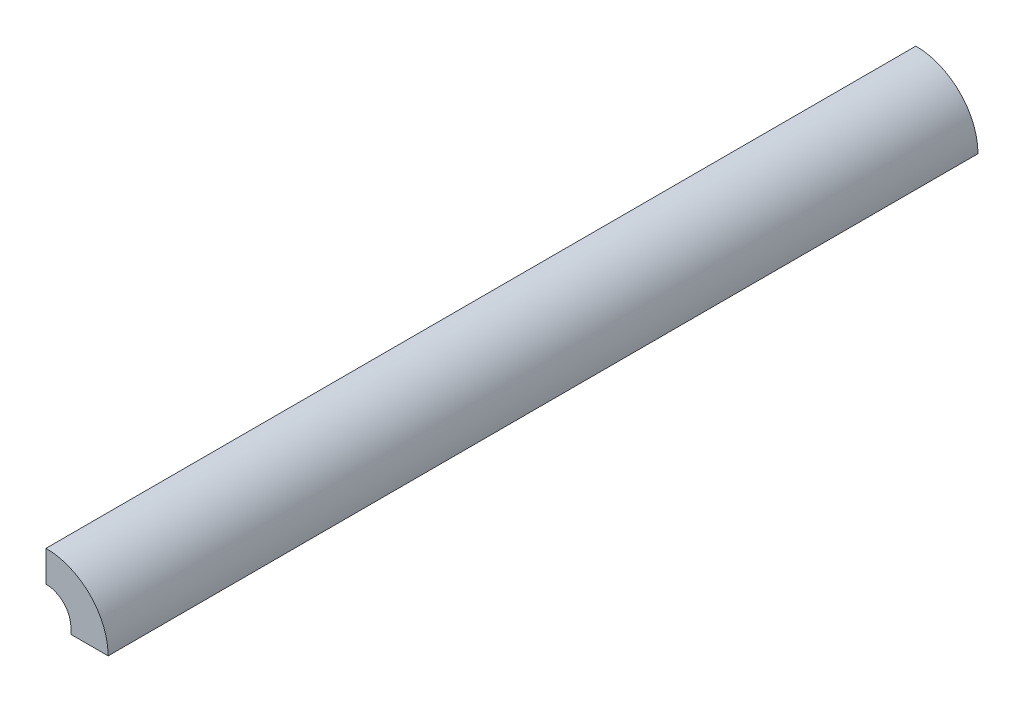
ISO-10303-21;
HEADER;
FILE_DESCRIPTION(('STEP AP214'),'2;1');
FILE_NAME('part.step','',(''),(''),'','','');
FILE_SCHEMA(('AUTOMOTIVE_DESIGN { 1 0 10303 214 1 1 1 1 }'));
ENDSEC;
DATA;
#1=APPLICATION_CONTEXT('core data for automotive mechanical design processes');
#2=APPLICATION_PROTOCOL_DEFINITION('international standard','automotive_design',2000,#1);
#3=PRODUCT_CONTEXT('',#1,'mechanical');
#4=PRODUCT('Part','Part','',(#3));
#5=PRODUCT_RELATED_PRODUCT_CATEGORY('part','',(#4));
#6=PRODUCT_DEFINITION_FORMATION('','',#4);
#7=PRODUCT_DEFINITION_CONTEXT('part definition',#1,'design');
#8=PRODUCT_DEFINITION('design','',#6,#7);
#9=PRODUCT_DEFINITION_SHAPE('','',#8);
#10=(LENGTH_UNIT() NAMED_UNIT(*) SI_UNIT(.MILLI.,.METRE.));
#11=(NAMED_UNIT(*) PLANE_ANGLE_UNIT() SI_UNIT($,.RADIAN.));
#12=(NAMED_UNIT(*) SI_UNIT($,.STERADIAN.) SOLID_ANGLE_UNIT());
#13=UNCERTAINTY_MEASURE_WITH_UNIT(LENGTH_MEASURE(1.E-05),#10,'distance_accuracy_value','');
#14=(GEOMETRIC_REPRESENTATION_CONTEXT(3) GLOBAL_UNCERTAINTY_ASSIGNED_CONTEXT((#13)) GLOBAL_UNIT_ASSIGNED_CONTEXT((#10,
#11,#12)) REPRESENTATION_CONTEXT('',''));
#15=CARTESIAN_POINT('',(0.,0.,0.));
#16=DIRECTION('',(0.,0.,1.));
#17=DIRECTION('',(1.,0.,0.));
#18=AXIS2_PLACEMENT_3D('',#15,#16,#17);
#19=CARTESIAN_POINT('',(0.,0.,350.));
#20=DIRECTION('',(0.,1.,0.));
#21=DIRECTION('',(0.,0.,1.));
#22=AXIS2_PLACEMENT_3D('',#19,#20,#21);
#23=PLANE('',#22);
#24=DIRECTION('',(0.,0.,1.));
#25=VECTOR('',#24,1.);
#26=CARTESIAN_POINT('',(10.,0.,175.));
#27=LINE('',#26,#25);
#28=CARTESIAN_POINT('',(10.,0.,194.152480481232));
#29=VERTEX_POINT('',#28);
#30=CARTESIAN_POINT('',(10.,0.,350.));
#31=VERTEX_POINT('',#30);
#32=EDGE_CURVE('E155',#29,#31,#27,.T.);
#33=ORIENTED_EDGE('',*,*,#32,.F.);
#34=CARTESIAN_POINT('',(10.,0.,194.152480481232));
#35=CARTESIAN_POINT('',(9.99998018925614,0.,193.71314903804));
#36=CARTESIAN_POINT('',(9.9964928072363,0.,193.273777713168));
#37=CARTESIAN_POINT('',(9.98069039021652,0.,192.395052165353));
#38=CARTESIAN_POINT('',(9.96837238276169,0.,191.955697997999));
#39=CARTESIAN_POINT('',(9.93290459009097,0.,191.074690346955));
#40=CARTESIAN_POINT('',(9.90968844253785,0.,190.633039401979));
#41=CARTESIAN_POINT('',(9.85032036967497,0.,189.75063378761));
#42=CARTESIAN_POINT('',(9.81416977504819,0.,189.309879030707));
#43=CARTESIAN_POINT('',(9.7260107513251,0.,188.422772337217));
#44=CARTESIAN_POINT('',(9.67375670732269,0.,187.976444343825));
#45=CARTESIAN_POINT('',(9.55109117178175,0.,187.086197515629));
#46=CARTESIAN_POINT('',(9.48067752973095,0.,186.64227897252));
#47=CARTESIAN_POINT('',(9.31919760113793,0.,185.759327821864));
#48=CARTESIAN_POINT('',(9.22818374708019,0.,185.320285728304));
#49=CARTESIAN_POINT('',(9.02253091561287,0.,184.447837761998));
#50=CARTESIAN_POINT('',(8.9078999811333,0.,184.014430023722));
#51=CARTESIAN_POINT('',(8.69096268278371,0.,183.286667692025));
#52=CARTESIAN_POINT('',(8.59557352944251,0.,182.990247202635));
#53=CARTESIAN_POINT('',(8.39074582721382,0.,182.402216480618));
#54=CARTESIAN_POINT('',(8.28130504330449,0.,182.110607021569));
#55=CARTESIAN_POINT('',(8.04743343061007,0.,181.534003278698));
#56=CARTESIAN_POINT('',(7.92302816690644,0.,181.248998677671));
#57=CARTESIAN_POINT('',(7.65792542520782,0.,180.686658613439));
#58=CARTESIAN_POINT('',(7.51722870084659,0.,180.409322796215));
#59=CARTESIAN_POINT('',(7.21688372318165,0.,179.861483769876));
#60=CARTESIAN_POINT('',(7.05706367836115,0.,179.591073836999));
#61=CARTESIAN_POINT('',(6.7185488606168,0.,179.062397225105));
#62=CARTESIAN_POINT('',(6.53985193238325,0.,178.804131937606));
#63=CARTESIAN_POINT('',(5.97411421109997,0.,178.052139061083));
#64=CARTESIAN_POINT('',(5.5568207249255,0.,177.580070850938));
#65=CARTESIAN_POINT('',(4.77000199835115,0.,176.847230078165));
#66=CARTESIAN_POINT('',(4.42091575849739,0.,176.564630350971));
#67=CARTESIAN_POINT('',(3.86721381231713,0.,176.18491538428));
#68=CARTESIAN_POINT('',(3.67762099426688,0.,176.065701470956));
#69=CARTESIAN_POINT('',(3.28900744351316,0.,175.843708084462));
#70=CARTESIAN_POINT('',(3.08998815009052,0.,175.7409261128));
#71=CARTESIAN_POINT('',(2.71034959795852,0.,175.565914392332));
#72=CARTESIAN_POINT('',(2.53076163151612,0.,175.491443391656));
#73=CARTESIAN_POINT('',(2.16615253023859,0.,175.357289714131));
#74=CARTESIAN_POINT('',(1.98113232779575,0.,175.297604515845));
#75=CARTESIAN_POINT('',(1.60704698381549,0.,175.194037216253));
#76=CARTESIAN_POINT('',(1.417989098389,0.,175.150128940234));
#77=CARTESIAN_POINT('',(1.03686871768771,0.,175.078732280556));
#78=CARTESIAN_POINT('',(0.844807901091297,0.,175.05123503755));
#79=CARTESIAN_POINT('',(0.543586606447139,0.,175.021462279594));
#80=CARTESIAN_POINT('',(0.434967821082352,0.,175.013414744946));
#81=CARTESIAN_POINT('',(0.217570676399444,0.,175.002684613787));
#82=CARTESIAN_POINT('',(0.108792571680735,0.,174.999996855403));
#83=CARTESIAN_POINT('',(0.,0.,175.));
#84=B_SPLINE_CURVE_WITH_KNOTS('',3,(#34,#35,#36,#37,#38,#39,#40,#41,#42,#43,#44,#45,#46,#47,#48,
#49,#50,#51,#52,#53,#54,#55,#56,#57,#58,#59,#60,#61,#62,#63,#64,#65,#66,#67,#68,#69,#70,#71,#72,
#73,#74,#75,#76,#77,#78,#79,#80,#81,#82,#83),.UNSPECIFIED.,.F.,.F.,(4,2,2,2,2,2,2,2,2,2,2,2,2,2,
2,2,2,2,2,2,2,2,2,2,4),(0.,1.31804093582335,2.63652574257431,3.96314550199424,5.28962881932513,
6.63743912308706,7.98540911180461,9.32998602344313,10.6741057864885,11.6079736821824,
12.5419903013156,13.474433337862,14.4068332573406,15.3483464641285,16.2899672866885,
18.1693632447245,19.5115692317236,20.1827601665664,20.8538489489553,21.4365038966371,
22.0190594150739,22.600643932571,23.1819142023473,23.5085450180642,23.8348611111894),.UNSPECIFIED.);
#85=CARTESIAN_POINT('',(0.,0.,175.));
#86=VERTEX_POINT('',#85);
#87=EDGE_CURVE('E11',#29,#86,#84,.T.);
#88=ORIENTED_EDGE('',*,*,#87,.T.);
#89=DIRECTION('',(0.,0.,-1.));
#90=VECTOR('',#89,1.);
#91=CARTESIAN_POINT('',(0.,0.,350.));
#92=LINE('',#91,#90);
#93=CARTESIAN_POINT('',(0.,0.,0.));
#94=VERTEX_POINT('',#93);
#95=EDGE_CURVE('E120',#86,#94,#92,.T.);
#96=ORIENTED_EDGE('',*,*,#95,.T.);
#97=DIRECTION('',(1.,0.,0.));
#98=VECTOR('',#97,1.);
#99=CARTESIAN_POINT('',(0.,0.,0.));
#100=LINE('',#99,#98);
#101=CARTESIAN_POINT('',(25.,0.,0.));
#102=VERTEX_POINT('',#101);
#103=EDGE_CURVE('E175',#94,#102,#100,.T.);
#104=ORIENTED_EDGE('',*,*,#103,.T.);
#105=DIRECTION('',(0.,0.,-1.));
#106=VECTOR('',#105,1.);
#107=CARTESIAN_POINT('',(25.,0.,350.));
#108=LINE('',#107,#106);
#109=CARTESIAN_POINT('',(25.,0.,350.));
#110=VERTEX_POINT('',#109);
#111=EDGE_CURVE('E163',#110,#102,#108,.T.);
#112=ORIENTED_EDGE('',*,*,#111,.F.);
#113=DIRECTION('',(1.,0.,0.));
#114=VECTOR('',#113,1.);
#115=CARTESIAN_POINT('',(0.,0.,350.));
#116=LINE('',#115,#114);
#117=EDGE_CURVE('E186',#31,#110,#116,.T.);
#118=ORIENTED_EDGE('',*,*,#117,.F.);
#119=EDGE_LOOP('',(#33,#88,#96,#104,#112,#118));
#120=FACE_BOUND('',#119,.T.);
#121=ADVANCED_FACE('F47',(#120),#23,.F.);
#122=CARTESIAN_POINT('',(0.,0.,350.));
#123=DIRECTION('',(0.,0.,-1.));
#124=DIRECTION('',(-1.,0.,0.));
#125=AXIS2_PLACEMENT_3D('',#122,#123,#124);
#126=CYLINDRICAL_SURFACE('',#125,25.);
#127=CARTESIAN_POINT('',(0.,0.,0.));
#128=DIRECTION('',(0.,0.,1.));
#129=DIRECTION('',(1.,0.,0.));
#130=AXIS2_PLACEMENT_3D('',#127,#128,#129);
#131=CIRCLE('',#130,25.);
#132=CARTESIAN_POINT('',(0.,25.,0.));
#133=VERTEX_POINT('',#132);
#134=EDGE_CURVE('E174',#102,#133,#131,.T.);
#135=ORIENTED_EDGE('',*,*,#134,.T.);
#136=DIRECTION('',(0.,0.,-1.));
#137=VECTOR('',#136,1.);
#138=CARTESIAN_POINT('',(0.,25.,350.));
#139=LINE('',#138,#137);
#140=CARTESIAN_POINT('',(0.,25.,350.));
#141=VERTEX_POINT('',#140);
#142=EDGE_CURVE('E160',#141,#133,#139,.T.);
#143=ORIENTED_EDGE('',*,*,#142,.F.);
#144=CARTESIAN_POINT('',(0.,0.,350.));
#145=DIRECTION('',(0.,0.,1.));
#146=DIRECTION('',(1.,0.,0.));
#147=AXIS2_PLACEMENT_3D('',#144,#145,#146);
#148=CIRCLE('',#147,25.);
#149=EDGE_CURVE('E117',#110,#141,#148,.T.);
#150=ORIENTED_EDGE('',*,*,#149,.F.);
#151=ORIENTED_EDGE('',*,*,#111,.T.);
#152=EDGE_LOOP('',(#135,#143,#150,#151));
#153=FACE_BOUND('',#152,.T.);
#154=ADVANCED_FACE('F137',(#153),#126,.T.);
#155=CARTESIAN_POINT('',(0.,0.,350.));
#156=DIRECTION('',(-1.,0.,0.));
#157=DIRECTION('',(0.,0.,1.));
#158=AXIS2_PLACEMENT_3D('',#155,#156,#157);
#159=PLANE('',#158);
#160=CARTESIAN_POINT('',(0.,-37.5,208.071891388307));
#161=DIRECTION('',(-1.,0.,0.));
#162=DIRECTION('',(0.,0.,1.));
#163=AXIS2_PLACEMENT_3D('',#160,#161,#162);
#164=CIRCLE('',#163,50.);
#165=CARTESIAN_POINT('',(0.,12.5,208.071891388307));
#166=VERTEX_POINT('',#165);
#167=EDGE_CURVE('E108',#166,#86,#164,.T.);
#168=ORIENTED_EDGE('',*,*,#167,.F.);
#169=DIRECTION('',(0.,0.,-1.));
#170=VECTOR('',#169,1.);
#171=CARTESIAN_POINT('',(0.,12.5,350.));
#172=LINE('',#171,#170);
#173=CARTESIAN_POINT('',(0.,12.5,350.));
#174=VERTEX_POINT('',#173);
#175=EDGE_CURVE('E101',#174,#166,#172,.T.);
#176=ORIENTED_EDGE('',*,*,#175,.F.);
#177=DIRECTION('',(0.,1.,0.));
#178=VECTOR('',#177,1.);
#179=CARTESIAN_POINT('',(0.,0.,350.));
#180=LINE('',#179,#178);
#181=EDGE_CURVE('E104',#174,#141,#180,.T.);
#182=ORIENTED_EDGE('',*,*,#181,.T.);
#183=ORIENTED_EDGE('',*,*,#142,.T.);
#184=DIRECTION('',(0.,1.,0.));
#185=VECTOR('',#184,1.);
#186=CARTESIAN_POINT('',(0.,0.,0.));
#187=LINE('',#186,#185);
#188=EDGE_CURVE('E158',#94,#133,#187,.T.);
#189=ORIENTED_EDGE('',*,*,#188,.F.);
#190=ORIENTED_EDGE('',*,*,#95,.F.);
#191=EDGE_LOOP('',(#168,#176,#182,#183,#189,#190));
#192=FACE_BOUND('',#191,.T.);
#193=ADVANCED_FACE('F103',(#192),#159,.T.);
#194=CARTESIAN_POINT('',(0.,0.,350.));
#195=DIRECTION('',(0.,0.,1.));
#196=DIRECTION('',(1.,0.,0.));
#197=AXIS2_PLACEMENT_3D('',#194,#195,#196);
#198=PLANE('',#197);
#199=ORIENTED_EDGE('',*,*,#181,.F.);
#200=CARTESIAN_POINT('',(0.,2.5,350.));
#201=DIRECTION('',(0.,0.,1.));
#202=DIRECTION('',(1.,0.,0.));
#203=AXIS2_PLACEMENT_3D('',#200,#201,#202);
#204=CIRCLE('',#203,10.);
#205=CARTESIAN_POINT('',(10.,2.5,350.));
#206=VERTEX_POINT('',#205);
#207=EDGE_CURVE('E58',#174,#206,#204,.F.);
#208=ORIENTED_EDGE('',*,*,#207,.T.);
#209=DIRECTION('',(0.,1.,0.));
#210=VECTOR('',#209,1.);
#211=CARTESIAN_POINT('',(10.,0.,350.));
#212=LINE('',#211,#210);
#213=EDGE_CURVE('E181',#31,#206,#212,.T.);
#214=ORIENTED_EDGE('',*,*,#213,.F.);
#215=ORIENTED_EDGE('',*,*,#117,.T.);
#216=ORIENTED_EDGE('',*,*,#149,.T.);
#217=EDGE_LOOP('',(#199,#208,#214,#215,#216));
#218=FACE_BOUND('',#217,.T.);
#219=ADVANCED_FACE('F113',(#218),#198,.T.);
#220=CARTESIAN_POINT('',(0.,0.,0.));
#221=DIRECTION('',(0.,0.,1.));
#222=DIRECTION('',(1.,0.,0.));
#223=AXIS2_PLACEMENT_3D('',#220,#221,#222);
#224=PLANE('',#223);
#225=ORIENTED_EDGE('',*,*,#103,.F.);
#226=ORIENTED_EDGE('',*,*,#188,.T.);
#227=ORIENTED_EDGE('',*,*,#134,.F.);
#228=EDGE_LOOP('',(#225,#226,#227));
#229=FACE_BOUND('',#228,.T.);
#230=ADVANCED_FACE('F149',(#229),#224,.F.);
#231=CARTESIAN_POINT('',(10.,-37.5,208.071891388307));
#232=DIRECTION('',(-1.,0.,0.));
#233=DIRECTION('',(0.,0.,1.));
#234=AXIS2_PLACEMENT_3D('',#231,#232,#233);
#235=PLANE('',#234);
#236=ORIENTED_EDGE('',*,*,#213,.T.);
#237=DIRECTION('',(0.,0.,-1.));
#238=VECTOR('',#237,1.);
#239=CARTESIAN_POINT('',(10.,2.49999999999997,208.071891388307));
#240=LINE('',#239,#238);
#241=CARTESIAN_POINT('',(10.,2.5,208.071891388307));
#242=VERTEX_POINT('',#241);
#243=EDGE_CURVE('E123',#206,#242,#240,.T.);
#244=ORIENTED_EDGE('',*,*,#243,.T.);
#245=CARTESIAN_POINT('',(10.,-37.5,208.071891388307));
#246=DIRECTION('',(-1.,0.,0.));
#247=DIRECTION('',(0.,0.,1.));
#248=AXIS2_PLACEMENT_3D('',#245,#246,#247);
#249=CIRCLE('',#248,40.);
#250=EDGE_CURVE('E71',#242,#29,#249,.T.);
#251=ORIENTED_EDGE('',*,*,#250,.T.);
#252=ORIENTED_EDGE('',*,*,#32,.T.);
#253=EDGE_LOOP('',(#236,#244,#251,#252));
#254=FACE_BOUND('',#253,.T.);
#255=ADVANCED_FACE('F144',(#254),#235,.T.);
#256=CARTESIAN_POINT('',(0.,-37.5,208.071891388307));
#257=DIRECTION('',(-1.,0.,0.));
#258=DIRECTION('',(0.,0.,1.));
#259=AXIS2_PLACEMENT_3D('',#256,#257,#258);
#260=TOROIDAL_SURFACE('',#259,40.,10.);
#261=ORIENTED_EDGE('',*,*,#87,.F.);
#262=ORIENTED_EDGE('',*,*,#250,.F.);
#263=CARTESIAN_POINT('',(0.,2.5,208.071891388307));
#264=DIRECTION('',(0.,0.,-1.));
#265=DIRECTION('',(-1.,0.,0.));
#266=AXIS2_PLACEMENT_3D('',#263,#264,#265);
#267=CIRCLE('',#266,10.);
#268=EDGE_CURVE('E52',#166,#242,#267,.T.);
#269=ORIENTED_EDGE('',*,*,#268,.F.);
#270=ORIENTED_EDGE('',*,*,#167,.T.);
#271=EDGE_LOOP('',(#261,#262,#269,#270));
#272=FACE_BOUND('',#271,.T.);
#273=ADVANCED_FACE('F49',(#272),#260,.F.);
#274=CARTESIAN_POINT('',(0.,2.49999999999997,208.071891388307));
#275=DIRECTION('',(0.,0.,-1.));
#276=DIRECTION('',(0.,1.,0.));
#277=AXIS2_PLACEMENT_3D('',#274,#275,#276);
#278=CYLINDRICAL_SURFACE('',#277,10.);
#279=ORIENTED_EDGE('',*,*,#207,.F.);
#280=ORIENTED_EDGE('',*,*,#175,.T.);
#281=ORIENTED_EDGE('',*,*,#268,.T.);
#282=ORIENTED_EDGE('',*,*,#243,.F.);
#283=EDGE_LOOP('',(#279,#280,#281,#282));
#284=FACE_BOUND('',#283,.T.);
#285=ADVANCED_FACE('F122',(#284),#278,.F.);
#286=CLOSED_SHELL('',(#121,#154,#193,#219,#230,#255,#273,#285));
#287=MANIFOLD_SOLID_BREP('B2',#286);
#288=ADVANCED_BREP_SHAPE_REPRESENTATION('',(#18,#287),#14);
#289=SHAPE_DEFINITION_REPRESENTATION(#9,#288);
ENDSEC;
END-ISO-10303-21;
